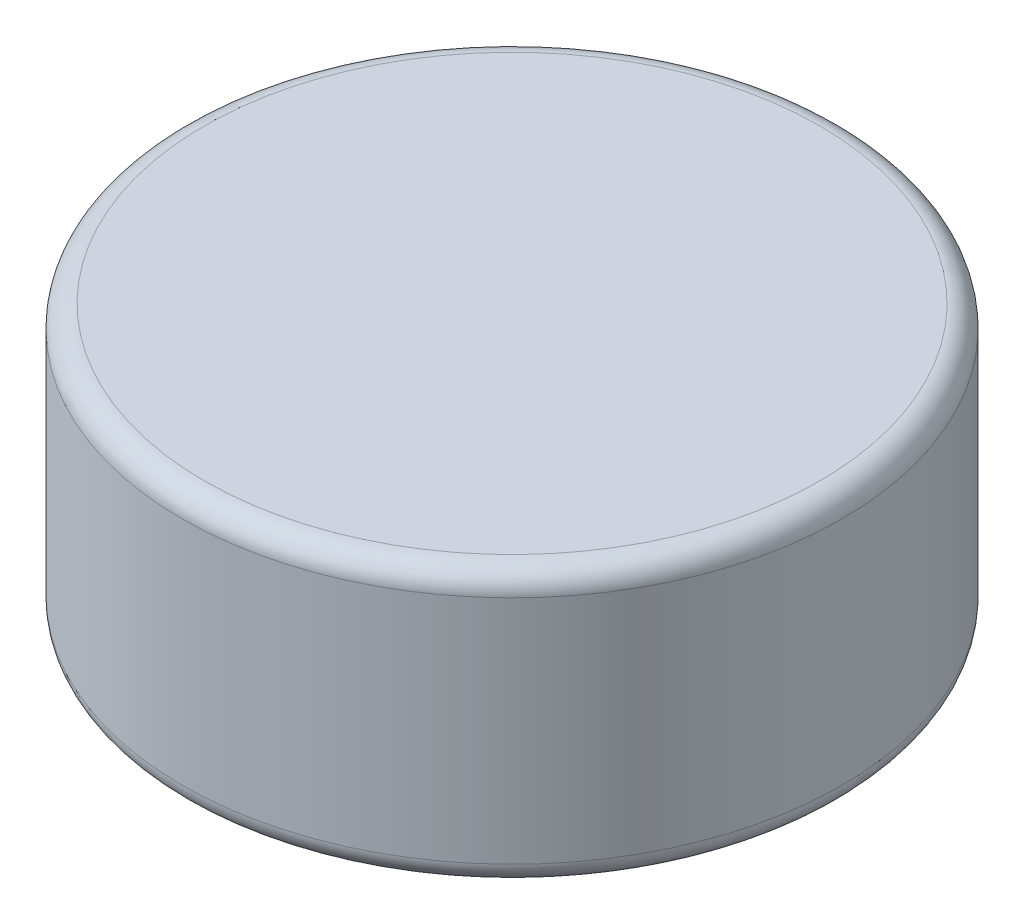
ISO-10303-21;
HEADER;
FILE_DESCRIPTION(('STEP AP214'),'2;1');
FILE_NAME('part.step','',(''),(''),'','','');
FILE_SCHEMA(('AUTOMOTIVE_DESIGN { 1 0 10303 214 1 1 1 1 }'));
ENDSEC;
DATA;
#1=APPLICATION_CONTEXT('core data for automotive mechanical design processes');
#2=APPLICATION_PROTOCOL_DEFINITION('international standard','automotive_design',2000,#1);
#3=PRODUCT_CONTEXT('',#1,'mechanical');
#4=PRODUCT('Part','Part','',(#3));
#5=PRODUCT_RELATED_PRODUCT_CATEGORY('part','',(#4));
#6=PRODUCT_DEFINITION_FORMATION('','',#4);
#7=PRODUCT_DEFINITION_CONTEXT('part definition',#1,'design');
#8=PRODUCT_DEFINITION('design','',#6,#7);
#9=PRODUCT_DEFINITION_SHAPE('','',#8);
#10=(LENGTH_UNIT() NAMED_UNIT(*) SI_UNIT(.MILLI.,.METRE.));
#11=(NAMED_UNIT(*) PLANE_ANGLE_UNIT() SI_UNIT($,.RADIAN.));
#12=(NAMED_UNIT(*) SI_UNIT($,.STERADIAN.) SOLID_ANGLE_UNIT());
#13=UNCERTAINTY_MEASURE_WITH_UNIT(LENGTH_MEASURE(1.E-05),#10,'distance_accuracy_value','');
#14=(GEOMETRIC_REPRESENTATION_CONTEXT(3) GLOBAL_UNCERTAINTY_ASSIGNED_CONTEXT((#13)) GLOBAL_UNIT_ASSIGNED_CONTEXT((#10,
#11,#12)) REPRESENTATION_CONTEXT('',''));
#15=CARTESIAN_POINT('',(0.,0.,0.));
#16=DIRECTION('',(0.,0.,1.));
#17=DIRECTION('',(1.,0.,0.));
#18=AXIS2_PLACEMENT_3D('',#15,#16,#17);
#19=CARTESIAN_POINT('',(0.,1.25,0.));
#20=DIRECTION('',(0.,-1.,0.));
#21=DIRECTION('',(0.,0.,-1.));
#22=AXIS2_PLACEMENT_3D('',#19,#20,#21);
#23=CYLINDRICAL_SURFACE('',#22,3.);
#24=CARTESIAN_POINT('',(0.,-1.05,0.));
#25=DIRECTION('',(0.,1.,0.));
#26=DIRECTION('',(0.,0.,1.));
#27=AXIS2_PLACEMENT_3D('',#24,#25,#26);
#28=CIRCLE('',#27,3.);
#29=CARTESIAN_POINT('',(0.,-1.05,3.));
#30=VERTEX_POINT('',#29);
#31=EDGE_CURVE('E43',#30,#30,#28,.T.);
#32=ORIENTED_EDGE('',*,*,#31,.T.);
#33=EDGE_LOOP('',(#32));
#34=FACE_BOUND('',#33,.T.);
#35=CARTESIAN_POINT('',(0.,1.05,0.));
#36=DIRECTION('',(0.,1.,0.));
#37=DIRECTION('',(0.,0.,1.));
#38=AXIS2_PLACEMENT_3D('',#35,#36,#37);
#39=CIRCLE('',#38,3.);
#40=CARTESIAN_POINT('',(0.,1.05,3.));
#41=VERTEX_POINT('',#40);
#42=EDGE_CURVE('E47',#41,#41,#39,.F.);
#43=ORIENTED_EDGE('',*,*,#42,.T.);
#44=EDGE_LOOP('',(#43));
#45=FACE_BOUND('',#44,.T.);
#46=ADVANCED_FACE('F32',(#34,#45),#23,.T.);
#47=CARTESIAN_POINT('',(0.,1.25,0.));
#48=DIRECTION('',(0.,1.,0.));
#49=DIRECTION('',(0.,0.,1.));
#50=AXIS2_PLACEMENT_3D('',#47,#48,#49);
#51=PLANE('',#50);
#52=CARTESIAN_POINT('',(0.,1.25,0.));
#53=DIRECTION('',(0.,1.,0.));
#54=DIRECTION('',(0.,0.,1.));
#55=AXIS2_PLACEMENT_3D('',#52,#53,#54);
#56=CIRCLE('',#55,2.8);
#57=CARTESIAN_POINT('',(0.,1.25,2.8));
#58=VERTEX_POINT('',#57);
#59=EDGE_CURVE('E10',#58,#58,#56,.T.);
#60=ORIENTED_EDGE('',*,*,#59,.T.);
#61=EDGE_LOOP('',(#60));
#62=FACE_BOUND('',#61,.T.);
#63=ADVANCED_FACE('F63',(#62),#51,.T.);
#64=CARTESIAN_POINT('',(0.,-1.25,0.));
#65=DIRECTION('',(0.,1.,0.));
#66=DIRECTION('',(0.,0.,1.));
#67=AXIS2_PLACEMENT_3D('',#64,#65,#66);
#68=PLANE('',#67);
#69=CARTESIAN_POINT('',(0.,-1.25,0.));
#70=DIRECTION('',(0.,1.,0.));
#71=DIRECTION('',(0.,0.,1.));
#72=AXIS2_PLACEMENT_3D('',#69,#70,#71);
#73=CIRCLE('',#72,2.8);
#74=CARTESIAN_POINT('',(0.,-1.25,2.8));
#75=VERTEX_POINT('',#74);
#76=EDGE_CURVE('E39',#75,#75,#73,.F.);
#77=ORIENTED_EDGE('',*,*,#76,.T.);
#78=EDGE_LOOP('',(#77));
#79=FACE_BOUND('',#78,.T.);
#80=ADVANCED_FACE('F60',(#79),#68,.F.);
#81=CARTESIAN_POINT('',(0.,-1.05,0.));
#82=DIRECTION('',(0.,1.,0.));
#83=DIRECTION('',(0.,0.,1.));
#84=AXIS2_PLACEMENT_3D('',#81,#82,#83);
#85=TOROIDAL_SURFACE('',#84,2.8,0.2);
#86=ORIENTED_EDGE('',*,*,#76,.F.);
#87=EDGE_LOOP('',(#86));
#88=FACE_BOUND('',#87,.T.);
#89=ORIENTED_EDGE('',*,*,#31,.F.);
#90=EDGE_LOOP('',(#89));
#91=FACE_BOUND('',#90,.T.);
#92=ADVANCED_FACE('F56',(#88,#91),#85,.T.);
#93=CARTESIAN_POINT('',(0.,1.05,0.));
#94=DIRECTION('',(0.,1.,0.));
#95=DIRECTION('',(0.,0.,1.));
#96=AXIS2_PLACEMENT_3D('',#93,#94,#95);
#97=TOROIDAL_SURFACE('',#96,2.8,0.2);
#98=ORIENTED_EDGE('',*,*,#42,.F.);
#99=EDGE_LOOP('',(#98));
#100=FACE_BOUND('',#99,.T.);
#101=ORIENTED_EDGE('',*,*,#59,.F.);
#102=EDGE_LOOP('',(#101));
#103=FACE_BOUND('',#102,.T.);
#104=ADVANCED_FACE('F34',(#100,#103),#97,.T.);
#105=CLOSED_SHELL('',(#46,#63,#80,#92,#104));
#106=MANIFOLD_SOLID_BREP('B2',#105);
#107=ADVANCED_BREP_SHAPE_REPRESENTATION('',(#18,#106),#14);
#108=SHAPE_DEFINITION_REPRESENTATION(#9,#107);
ENDSEC;
END-ISO-10303-21;
